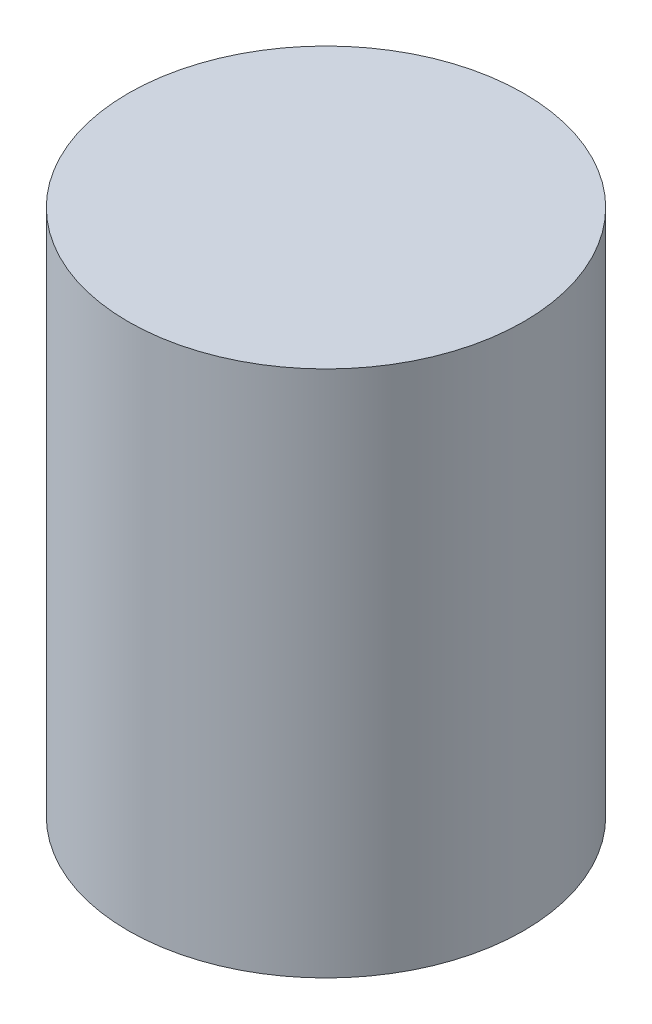
ISO-10303-21;
HEADER;
FILE_DESCRIPTION(('STEP AP214'),'2;1');
FILE_NAME('part.step','',(''),(''),'','','');
FILE_SCHEMA(('AUTOMOTIVE_DESIGN { 1 0 10303 214 1 1 1 1 }'));
ENDSEC;
DATA;
#1=APPLICATION_CONTEXT('core data for automotive mechanical design processes');
#2=APPLICATION_PROTOCOL_DEFINITION('international standard','automotive_design',2000,#1);
#3=PRODUCT_CONTEXT('',#1,'mechanical');
#4=PRODUCT('Part','Part','',(#3));
#5=PRODUCT_RELATED_PRODUCT_CATEGORY('part','',(#4));
#6=PRODUCT_DEFINITION_FORMATION('','',#4);
#7=PRODUCT_DEFINITION_CONTEXT('part definition',#1,'design');
#8=PRODUCT_DEFINITION('design','',#6,#7);
#9=PRODUCT_DEFINITION_SHAPE('','',#8);
#10=(LENGTH_UNIT() NAMED_UNIT(*) SI_UNIT(.MILLI.,.METRE.));
#11=(NAMED_UNIT(*) PLANE_ANGLE_UNIT() SI_UNIT($,.RADIAN.));
#12=(NAMED_UNIT(*) SI_UNIT($,.STERADIAN.) SOLID_ANGLE_UNIT());
#13=UNCERTAINTY_MEASURE_WITH_UNIT(LENGTH_MEASURE(1.E-05),#10,'distance_accuracy_value','');
#14=(GEOMETRIC_REPRESENTATION_CONTEXT(3) GLOBAL_UNCERTAINTY_ASSIGNED_CONTEXT((#13)) GLOBAL_UNIT_ASSIGNED_CONTEXT((#10,
#11,#12)) REPRESENTATION_CONTEXT('',''));
#15=CARTESIAN_POINT('',(0.,0.,0.));
#16=DIRECTION('',(0.,0.,1.));
#17=DIRECTION('',(1.,0.,0.));
#18=AXIS2_PLACEMENT_3D('',#15,#16,#17);
#19=CARTESIAN_POINT('',(0.,304.8,0.));
#20=DIRECTION('',(0.,-1.,0.));
#21=DIRECTION('',(0.,0.,-1.));
#22=AXIS2_PLACEMENT_3D('',#19,#20,#21);
#23=CYLINDRICAL_SURFACE('',#22,57.15);
#24=CARTESIAN_POINT('',(0.,304.8,0.));
#25=DIRECTION('',(0.,1.,0.));
#26=DIRECTION('',(0.,0.,1.));
#27=AXIS2_PLACEMENT_3D('',#24,#25,#26);
#28=CIRCLE('',#27,57.15);
#29=CARTESIAN_POINT('',(0.,304.8,-57.15));
#30=VERTEX_POINT('',#29);
#31=EDGE_CURVE('E10',#30,#30,#28,.T.);
#32=CARTESIAN_POINT('',(0.,152.4,0.));
#33=DIRECTION('',(0.,1.,0.));
#34=DIRECTION('',(0.,0.,1.));
#35=AXIS2_PLACEMENT_3D('',#32,#33,#34);
#36=CIRCLE('',#35,57.15);
#37=CARTESIAN_POINT('',(0.,152.4,-57.15));
#38=VERTEX_POINT('',#37);
#39=EDGE_CURVE('E33',#38,#38,#36,.T.);
#40=CARTESIAN_POINT('',(0.,304.8,-57.15));
#41=CARTESIAN_POINT('',(0.,303.2125,-57.15));
#42=CARTESIAN_POINT('',(0.,301.625,-57.15));
#43=CARTESIAN_POINT('',(0.,298.45,-57.15));
#44=CARTESIAN_POINT('',(0.,296.8625,-57.15));
#45=CARTESIAN_POINT('',(0.,293.6875,-57.15));
#46=CARTESIAN_POINT('',(0.,292.1,-57.15));
#47=CARTESIAN_POINT('',(0.,288.925,-57.15));
#48=CARTESIAN_POINT('',(0.,287.3375,-57.15));
#49=CARTESIAN_POINT('',(0.,284.1625,-57.15));
#50=CARTESIAN_POINT('',(0.,282.575,-57.15));
#51=CARTESIAN_POINT('',(0.,279.4,-57.15));
#52=CARTESIAN_POINT('',(0.,277.8125,-57.15));
#53=CARTESIAN_POINT('',(0.,274.6375,-57.15));
#54=CARTESIAN_POINT('',(0.,273.05,-57.15));
#55=CARTESIAN_POINT('',(0.,269.875,-57.15));
#56=CARTESIAN_POINT('',(0.,268.2875,-57.15));
#57=CARTESIAN_POINT('',(0.,265.1125,-57.15));
#58=CARTESIAN_POINT('',(0.,263.525,-57.15));
#59=CARTESIAN_POINT('',(0.,260.35,-57.15));
#60=CARTESIAN_POINT('',(0.,258.7625,-57.15));
#61=CARTESIAN_POINT('',(0.,255.5875,-57.15));
#62=CARTESIAN_POINT('',(0.,254.,-57.15));
#63=CARTESIAN_POINT('',(0.,250.825,-57.15));
#64=CARTESIAN_POINT('',(0.,249.2375,-57.15));
#65=CARTESIAN_POINT('',(0.,246.0625,-57.15));
#66=CARTESIAN_POINT('',(0.,244.475,-57.15));
#67=CARTESIAN_POINT('',(0.,241.3,-57.15));
#68=CARTESIAN_POINT('',(0.,239.7125,-57.15));
#69=CARTESIAN_POINT('',(0.,236.5375,-57.15));
#70=CARTESIAN_POINT('',(0.,234.95,-57.15));
#71=CARTESIAN_POINT('',(0.,231.775,-57.15));
#72=CARTESIAN_POINT('',(0.,230.1875,-57.15));
#73=CARTESIAN_POINT('',(0.,227.0125,-57.15));
#74=CARTESIAN_POINT('',(0.,225.425,-57.15));
#75=CARTESIAN_POINT('',(0.,222.25,-57.15));
#76=CARTESIAN_POINT('',(0.,220.6625,-57.15));
#77=CARTESIAN_POINT('',(0.,217.4875,-57.15));
#78=CARTESIAN_POINT('',(0.,215.9,-57.15));
#79=CARTESIAN_POINT('',(0.,212.725,-57.15));
#80=CARTESIAN_POINT('',(0.,211.1375,-57.15));
#81=CARTESIAN_POINT('',(0.,207.9625,-57.15));
#82=CARTESIAN_POINT('',(0.,206.375,-57.15));
#83=CARTESIAN_POINT('',(0.,203.2,-57.15));
#84=CARTESIAN_POINT('',(0.,201.6125,-57.15));
#85=CARTESIAN_POINT('',(0.,198.4375,-57.15));
#86=CARTESIAN_POINT('',(0.,196.85,-57.15));
#87=CARTESIAN_POINT('',(0.,193.675,-57.15));
#88=CARTESIAN_POINT('',(0.,192.0875,-57.15));
#89=CARTESIAN_POINT('',(0.,188.9125,-57.15));
#90=CARTESIAN_POINT('',(0.,187.325,-57.15));
#91=CARTESIAN_POINT('',(0.,184.15,-57.15));
#92=CARTESIAN_POINT('',(0.,182.5625,-57.15));
#93=CARTESIAN_POINT('',(0.,179.3875,-57.15));
#94=CARTESIAN_POINT('',(0.,177.8,-57.15));
#95=CARTESIAN_POINT('',(0.,174.625,-57.15));
#96=CARTESIAN_POINT('',(0.,173.0375,-57.15));
#97=CARTESIAN_POINT('',(0.,169.8625,-57.15));
#98=CARTESIAN_POINT('',(0.,168.275,-57.15));
#99=CARTESIAN_POINT('',(0.,165.1,-57.15));
#100=CARTESIAN_POINT('',(0.,163.5125,-57.15));
#101=CARTESIAN_POINT('',(0.,160.3375,-57.15));
#102=CARTESIAN_POINT('',(0.,158.75,-57.15));
#103=CARTESIAN_POINT('',(0.,155.575,-57.15));
#104=CARTESIAN_POINT('',(0.,153.9875,-57.15));
#105=CARTESIAN_POINT('',(0.,152.4,-57.15));
#106=B_SPLINE_CURVE_WITH_KNOTS('',3,(#40,#41,#42,#43,#44,#45,#46,#47,#48,#49,#50,#51,#52,#53,
#54,#55,#56,#57,#58,#59,#60,#61,#62,#63,#64,#65,#66,#67,#68,#69,#70,#71,#72,#73,#74,#75,#76,#77,
#78,#79,#80,#81,#82,#83,#84,#85,#86,#87,#88,#89,#90,#91,#92,#93,#94,#95,#96,#97,#98,#99,#100,
#101,#102,#103,#104,#105),.UNSPECIFIED.,.F.,.F.,(4,2,2,2,2,2,2,2,2,2,2,2,2,2,2,2,2,2,2,2,2,2,2,
2,2,2,2,2,2,2,2,2,4),(0.,4.76249999999995,9.52499999999995,14.2875,19.05,23.8125,28.575,33.3375,
38.1,42.8625,47.625,52.3875,57.15,61.9125,66.675,71.4375,76.2,80.9625,85.725,90.4874999999999,
95.2499999999999,100.0125,104.775,109.5375,114.3,119.0625,123.825,128.5875,133.35,138.1125,
142.875,147.6375,152.4),.UNSPECIFIED.);
#107=EDGE_CURVE('BSEAM30',#30,#38,#106,.T.);
#108=ORIENTED_EDGE('',*,*,#31,.F.);
#109=ORIENTED_EDGE('',*,*,#39,.T.);
#110=ORIENTED_EDGE('',*,*,#107,.T.);
#111=ORIENTED_EDGE('',*,*,#107,.F.);
#112=EDGE_LOOP('',(#108,#110,#109,#111));
#113=FACE_BOUND('',#112,.T.);
#114=ADVANCED_FACE('F30',(#113),#23,.T.);
#115=CARTESIAN_POINT('',(0.,304.8,0.));
#116=DIRECTION('',(0.,1.,0.));
#117=DIRECTION('',(0.,0.,1.));
#118=AXIS2_PLACEMENT_3D('',#115,#116,#117);
#119=PLANE('',#118);
#120=ORIENTED_EDGE('',*,*,#31,.T.);
#121=EDGE_LOOP('',(#120));
#122=FACE_BOUND('',#121,.T.);
#123=ADVANCED_FACE('F45',(#122),#119,.T.);
#124=CARTESIAN_POINT('',(0.,152.4,0.));
#125=DIRECTION('',(0.,1.,0.));
#126=DIRECTION('',(0.,0.,1.));
#127=AXIS2_PLACEMENT_3D('',#124,#125,#126);
#128=PLANE('',#127);
#129=ORIENTED_EDGE('',*,*,#39,.F.);
#130=EDGE_LOOP('',(#129));
#131=FACE_BOUND('',#130,.T.);
#132=ADVANCED_FACE('F43',(#131),#128,.F.);
#133=CLOSED_SHELL('',(#114,#123,#132));
#134=MANIFOLD_SOLID_BREP('B2',#133);
#135=ADVANCED_BREP_SHAPE_REPRESENTATION('',(#18,#134),#14);
#136=SHAPE_DEFINITION_REPRESENTATION(#9,#135);
ENDSEC;
END-ISO-10303-21;
